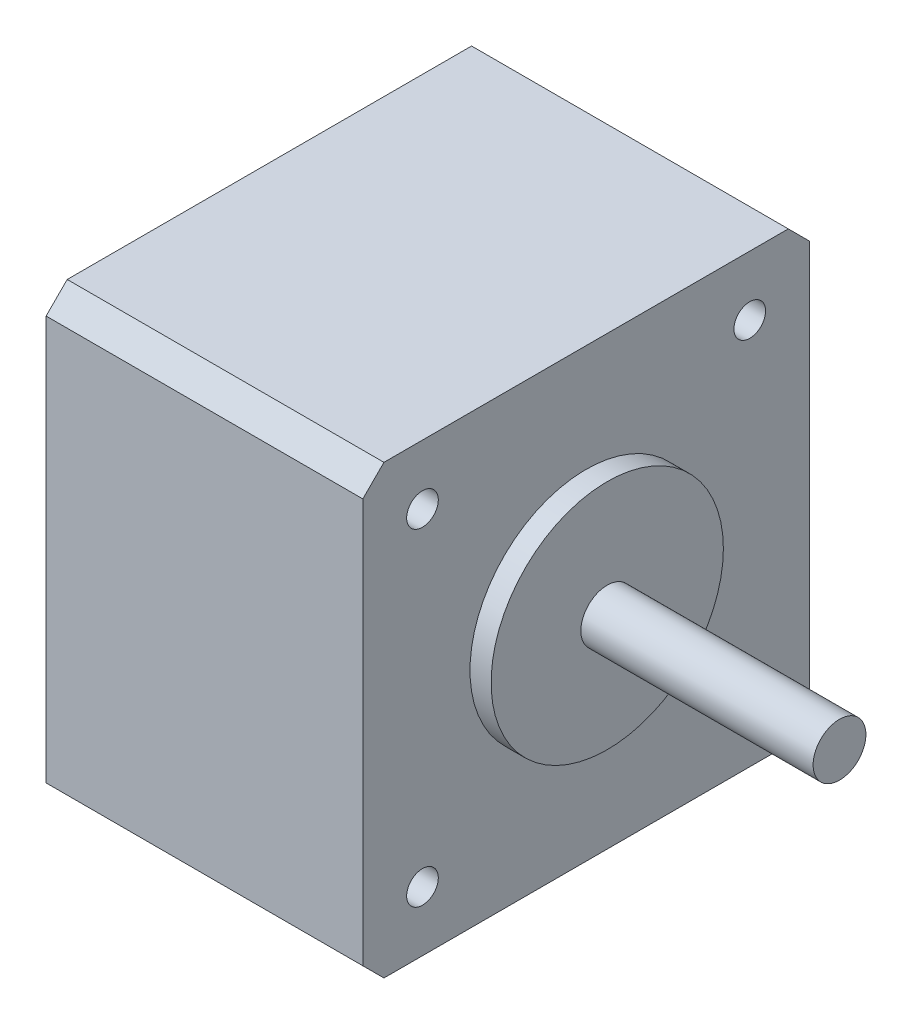
ISO-10303-21;
HEADER;
FILE_DESCRIPTION(('STEP AP214'),'2;1');
FILE_NAME('part.step','',(''),(''),'','','');
FILE_SCHEMA(('AUTOMOTIVE_DESIGN { 1 0 10303 214 1 1 1 1 }'));
ENDSEC;
DATA;
#1=APPLICATION_CONTEXT('core data for automotive mechanical design processes');
#2=APPLICATION_PROTOCOL_DEFINITION('international standard','automotive_design',2000,#1);
#3=PRODUCT_CONTEXT('',#1,'mechanical');
#4=PRODUCT('Part','Part','',(#3));
#5=PRODUCT_RELATED_PRODUCT_CATEGORY('part','',(#4));
#6=PRODUCT_DEFINITION_FORMATION('','',#4);
#7=PRODUCT_DEFINITION_CONTEXT('part definition',#1,'design');
#8=PRODUCT_DEFINITION('design','',#6,#7);
#9=PRODUCT_DEFINITION_SHAPE('','',#8);
#10=(LENGTH_UNIT() NAMED_UNIT(*) SI_UNIT(.MILLI.,.METRE.));
#11=(NAMED_UNIT(*) PLANE_ANGLE_UNIT() SI_UNIT($,.RADIAN.));
#12=(NAMED_UNIT(*) SI_UNIT($,.STERADIAN.) SOLID_ANGLE_UNIT());
#13=UNCERTAINTY_MEASURE_WITH_UNIT(LENGTH_MEASURE(1.E-05),#10,'distance_accuracy_value','');
#14=(GEOMETRIC_REPRESENTATION_CONTEXT(3) GLOBAL_UNCERTAINTY_ASSIGNED_CONTEXT((#13)) GLOBAL_UNIT_ASSIGNED_CONTEXT((#10,
#11,#12)) REPRESENTATION_CONTEXT('',''));
#15=CARTESIAN_POINT('',(0.,0.,0.));
#16=DIRECTION('',(0.,0.,1.));
#17=DIRECTION('',(1.,0.,0.));
#18=AXIS2_PLACEMENT_3D('',#15,#16,#17);
#19=CARTESIAN_POINT('',(30.,-21.15,21.15));
#20=DIRECTION('',(0.,0.,-1.));
#21=DIRECTION('',(-1.,0.,0.));
#22=AXIS2_PLACEMENT_3D('',#19,#20,#21);
#23=PLANE('',#22);
#24=DIRECTION('',(0.,-1.,0.));
#25=VECTOR('',#24,1.);
#26=CARTESIAN_POINT('',(0.,-21.15,21.15));
#27=LINE('',#26,#25);
#28=CARTESIAN_POINT('',(0.,19.15,21.15));
#29=VERTEX_POINT('',#28);
#30=CARTESIAN_POINT('',(0.,-19.15,21.15));
#31=VERTEX_POINT('',#30);
#32=EDGE_CURVE('E128',#29,#31,#27,.T.);
#33=ORIENTED_EDGE('',*,*,#32,.T.);
#34=DIRECTION('',(1.,0.,0.));
#35=VECTOR('',#34,1.);
#36=CARTESIAN_POINT('',(30.,-19.15,21.15));
#37=LINE('',#36,#35);
#38=CARTESIAN_POINT('',(30.,-19.15,21.15));
#39=VERTEX_POINT('',#38);
#40=EDGE_CURVE('E106',#31,#39,#37,.T.);
#41=ORIENTED_EDGE('',*,*,#40,.T.);
#42=DIRECTION('',(0.,-1.,0.));
#43=VECTOR('',#42,1.);
#44=CARTESIAN_POINT('',(30.,-21.15,21.15));
#45=LINE('',#44,#43);
#46=CARTESIAN_POINT('',(30.,19.15,21.15));
#47=VERTEX_POINT('',#46);
#48=EDGE_CURVE('E138',#47,#39,#45,.T.);
#49=ORIENTED_EDGE('',*,*,#48,.F.);
#50=DIRECTION('',(-1.,0.,0.));
#51=VECTOR('',#50,1.);
#52=CARTESIAN_POINT('',(30.,19.15,21.15));
#53=LINE('',#52,#51);
#54=EDGE_CURVE('E111',#47,#29,#53,.T.);
#55=ORIENTED_EDGE('',*,*,#54,.T.);
#56=EDGE_LOOP('',(#33,#41,#49,#55));
#57=FACE_BOUND('',#56,.T.);
#58=ADVANCED_FACE('F35',(#57),#23,.F.);
#59=CARTESIAN_POINT('',(30.,-21.15,-21.15));
#60=DIRECTION('',(0.,1.,0.));
#61=DIRECTION('',(0.,0.,1.));
#62=AXIS2_PLACEMENT_3D('',#59,#60,#61);
#63=PLANE('',#62);
#64=DIRECTION('',(0.,0.,-1.));
#65=VECTOR('',#64,1.);
#66=CARTESIAN_POINT('',(30.,-21.15,-21.15));
#67=LINE('',#66,#65);
#68=CARTESIAN_POINT('',(30.,-21.15,19.15));
#69=VERTEX_POINT('',#68);
#70=CARTESIAN_POINT('',(30.,-21.15,-19.15));
#71=VERTEX_POINT('',#70);
#72=EDGE_CURVE('E121',#69,#71,#67,.T.);
#73=ORIENTED_EDGE('',*,*,#72,.F.);
#74=DIRECTION('',(-1.,0.,0.));
#75=VECTOR('',#74,1.);
#76=CARTESIAN_POINT('',(30.,-21.15,19.15));
#77=LINE('',#76,#75);
#78=CARTESIAN_POINT('',(0.,-21.15,19.15));
#79=VERTEX_POINT('',#78);
#80=EDGE_CURVE('E105',#69,#79,#77,.T.);
#81=ORIENTED_EDGE('',*,*,#80,.T.);
#82=DIRECTION('',(0.,0.,-1.));
#83=VECTOR('',#82,1.);
#84=CARTESIAN_POINT('',(0.,-21.15,-21.15));
#85=LINE('',#84,#83);
#86=CARTESIAN_POINT('',(0.,-21.15,-19.15));
#87=VERTEX_POINT('',#86);
#88=EDGE_CURVE('E118',#79,#87,#85,.T.);
#89=ORIENTED_EDGE('',*,*,#88,.T.);
#90=DIRECTION('',(1.,0.,0.));
#91=VECTOR('',#90,1.);
#92=CARTESIAN_POINT('',(30.,-21.15,-19.15));
#93=LINE('',#92,#91);
#94=EDGE_CURVE('E123',#87,#71,#93,.T.);
#95=ORIENTED_EDGE('',*,*,#94,.T.);
#96=EDGE_LOOP('',(#73,#81,#89,#95));
#97=FACE_BOUND('',#96,.T.);
#98=ADVANCED_FACE('F117',(#97),#63,.F.);
#99=CARTESIAN_POINT('',(30.,-21.15,-21.15));
#100=DIRECTION('',(0.,0.,1.));
#101=DIRECTION('',(1.,0.,0.));
#102=AXIS2_PLACEMENT_3D('',#99,#100,#101);
#103=PLANE('',#102);
#104=DIRECTION('',(0.,1.,0.));
#105=VECTOR('',#104,1.);
#106=CARTESIAN_POINT('',(30.,-21.15,-21.15));
#107=LINE('',#106,#105);
#108=CARTESIAN_POINT('',(30.,-19.15,-21.15));
#109=VERTEX_POINT('',#108);
#110=CARTESIAN_POINT('',(30.,19.15,-21.15));
#111=VERTEX_POINT('',#110);
#112=EDGE_CURVE('E164',#109,#111,#107,.T.);
#113=ORIENTED_EDGE('',*,*,#112,.F.);
#114=DIRECTION('',(-1.,0.,0.));
#115=VECTOR('',#114,1.);
#116=CARTESIAN_POINT('',(30.,-19.15,-21.15));
#117=LINE('',#116,#115);
#118=CARTESIAN_POINT('',(0.,-19.15,-21.15));
#119=VERTEX_POINT('',#118);
#120=EDGE_CURVE('E157',#109,#119,#117,.T.);
#121=ORIENTED_EDGE('',*,*,#120,.T.);
#122=DIRECTION('',(0.,1.,0.));
#123=VECTOR('',#122,1.);
#124=CARTESIAN_POINT('',(0.,-21.15,-21.15));
#125=LINE('',#124,#123);
#126=CARTESIAN_POINT('',(0.,19.15,-21.15));
#127=VERTEX_POINT('',#126);
#128=EDGE_CURVE('E127',#119,#127,#125,.T.);
#129=ORIENTED_EDGE('',*,*,#128,.T.);
#130=DIRECTION('',(1.,0.,0.));
#131=VECTOR('',#130,1.);
#132=CARTESIAN_POINT('',(30.,19.15,-21.15));
#133=LINE('',#132,#131);
#134=EDGE_CURVE('E155',#127,#111,#133,.T.);
#135=ORIENTED_EDGE('',*,*,#134,.T.);
#136=EDGE_LOOP('',(#113,#121,#129,#135));
#137=FACE_BOUND('',#136,.T.);
#138=ADVANCED_FACE('F162',(#137),#103,.F.);
#139=CARTESIAN_POINT('',(30.,21.15,-21.15));
#140=DIRECTION('',(0.,-1.,0.));
#141=DIRECTION('',(0.,0.,-1.));
#142=AXIS2_PLACEMENT_3D('',#139,#140,#141);
#143=PLANE('',#142);
#144=DIRECTION('',(0.,0.,1.));
#145=VECTOR('',#144,1.);
#146=CARTESIAN_POINT('',(30.,21.15,-21.15));
#147=LINE('',#146,#145);
#148=CARTESIAN_POINT('',(30.,21.15,-19.15));
#149=VERTEX_POINT('',#148);
#150=CARTESIAN_POINT('',(30.,21.15,19.15));
#151=VERTEX_POINT('',#150);
#152=EDGE_CURVE('E139',#149,#151,#147,.T.);
#153=ORIENTED_EDGE('',*,*,#152,.F.);
#154=DIRECTION('',(-1.,0.,0.));
#155=VECTOR('',#154,1.);
#156=CARTESIAN_POINT('',(30.,21.15,-19.15));
#157=LINE('',#156,#155);
#158=CARTESIAN_POINT('',(0.,21.15,-19.15));
#159=VERTEX_POINT('',#158);
#160=EDGE_CURVE('E11',#149,#159,#157,.T.);
#161=ORIENTED_EDGE('',*,*,#160,.T.);
#162=DIRECTION('',(0.,0.,1.));
#163=VECTOR('',#162,1.);
#164=CARTESIAN_POINT('',(0.,21.15,-21.15));
#165=LINE('',#164,#163);
#166=CARTESIAN_POINT('',(0.,21.15,19.15));
#167=VERTEX_POINT('',#166);
#168=EDGE_CURVE('E131',#159,#167,#165,.T.);
#169=ORIENTED_EDGE('',*,*,#168,.T.);
#170=DIRECTION('',(1.,0.,0.));
#171=VECTOR('',#170,1.);
#172=CARTESIAN_POINT('',(30.,21.15,19.15));
#173=LINE('',#172,#171);
#174=EDGE_CURVE('E43',#167,#151,#173,.T.);
#175=ORIENTED_EDGE('',*,*,#174,.T.);
#176=EDGE_LOOP('',(#153,#161,#169,#175));
#177=FACE_BOUND('',#176,.T.);
#178=ADVANCED_FACE('F171',(#177),#143,.F.);
#179=CARTESIAN_POINT('',(30.,0.,0.));
#180=DIRECTION('',(1.,0.,0.));
#181=DIRECTION('',(0.,0.,-1.));
#182=AXIS2_PLACEMENT_3D('',#179,#180,#181);
#183=PLANE('',#182);
#184=CARTESIAN_POINT('',(30.,0.,0.));
#185=DIRECTION('',(1.,0.,0.));
#186=DIRECTION('',(0.,0.,-1.));
#187=AXIS2_PLACEMENT_3D('',#184,#185,#186);
#188=CIRCLE('',#187,11.);
#189=CARTESIAN_POINT('',(30.,0.,-11.));
#190=VERTEX_POINT('',#189);
#191=EDGE_CURVE('E202',#190,#190,#188,.T.);
#192=ORIENTED_EDGE('',*,*,#191,.F.);
#193=EDGE_LOOP('',(#192));
#194=FACE_BOUND('',#193,.T.);
#195=CARTESIAN_POINT('',(30.,15.5000000000009,-15.5));
#196=DIRECTION('',(1.,0.,0.));
#197=DIRECTION('',(0.,0.,-1.));
#198=AXIS2_PLACEMENT_3D('',#195,#196,#197);
#199=CIRCLE('',#198,1.5000000000009);
#200=CARTESIAN_POINT('',(30.,15.5000000000009,-17.0000000000009));
#201=VERTEX_POINT('',#200);
#202=EDGE_CURVE('E197',#201,#201,#199,.T.);
#203=ORIENTED_EDGE('',*,*,#202,.F.);
#204=EDGE_LOOP('',(#203));
#205=FACE_BOUND('',#204,.T.);
#206=CARTESIAN_POINT('',(30.,-15.4999999999991,-15.5000000000009));
#207=DIRECTION('',(1.,0.,0.));
#208=DIRECTION('',(0.,0.,-1.));
#209=AXIS2_PLACEMENT_3D('',#206,#207,#208);
#210=CIRCLE('',#209,1.50000000000122);
#211=CARTESIAN_POINT('',(30.,-15.4999999999991,-17.0000000000021));
#212=VERTEX_POINT('',#211);
#213=EDGE_CURVE('E191',#212,#212,#210,.T.);
#214=ORIENTED_EDGE('',*,*,#213,.F.);
#215=EDGE_LOOP('',(#214));
#216=FACE_BOUND('',#215,.T.);
#217=CARTESIAN_POINT('',(30.,-15.5,15.4999999999991));
#218=DIRECTION('',(1.,0.,0.));
#219=DIRECTION('',(0.,0.,-1.));
#220=AXIS2_PLACEMENT_3D('',#217,#218,#219);
#221=CIRCLE('',#220,1.50000000000046);
#222=CARTESIAN_POINT('',(30.,-15.5,13.9999999999987));
#223=VERTEX_POINT('',#222);
#224=EDGE_CURVE('E184',#223,#223,#221,.T.);
#225=ORIENTED_EDGE('',*,*,#224,.F.);
#226=EDGE_LOOP('',(#225));
#227=FACE_BOUND('',#226,.T.);
#228=CARTESIAN_POINT('',(30.,15.5,15.5));
#229=DIRECTION('',(1.,0.,0.));
#230=DIRECTION('',(0.,0.,-1.));
#231=AXIS2_PLACEMENT_3D('',#228,#229,#230);
#232=CIRCLE('',#231,1.5);
#233=CARTESIAN_POINT('',(30.,15.5,14.));
#234=VERTEX_POINT('',#233);
#235=EDGE_CURVE('E178',#234,#234,#232,.T.);
#236=ORIENTED_EDGE('',*,*,#235,.F.);
#237=EDGE_LOOP('',(#236));
#238=FACE_BOUND('',#237,.T.);
#239=ORIENTED_EDGE('',*,*,#48,.T.);
#240=DIRECTION('',(0.,0.707106781186549,0.707106781186546));
#241=VECTOR('',#240,1.);
#242=CARTESIAN_POINT('',(30.,-20.15,20.15));
#243=LINE('',#242,#241);
#244=EDGE_CURVE('E153',#39,#69,#243,.F.);
#245=ORIENTED_EDGE('',*,*,#244,.T.);
#246=ORIENTED_EDGE('',*,*,#72,.T.);
#247=DIRECTION('',(0.,-0.707106781186546,0.707106781186549));
#248=VECTOR('',#247,1.);
#249=CARTESIAN_POINT('',(30.,-20.15,-20.1499999999999));
#250=LINE('',#249,#248);
#251=EDGE_CURVE('E151',#71,#109,#250,.F.);
#252=ORIENTED_EDGE('',*,*,#251,.T.);
#253=ORIENTED_EDGE('',*,*,#112,.T.);
#254=DIRECTION('',(0.,-0.707106781186548,-0.707106781186547));
#255=VECTOR('',#254,1.);
#256=CARTESIAN_POINT('',(30.,20.15,-20.15));
#257=LINE('',#256,#255);
#258=EDGE_CURVE('E56',#111,#149,#257,.F.);
#259=ORIENTED_EDGE('',*,*,#258,.T.);
#260=ORIENTED_EDGE('',*,*,#152,.T.);
#261=DIRECTION('',(0.,0.707106781186548,-0.707106781186547));
#262=VECTOR('',#261,1.);
#263=CARTESIAN_POINT('',(30.,20.15,20.15));
#264=LINE('',#263,#262);
#265=EDGE_CURVE('E148',#151,#47,#264,.F.);
#266=ORIENTED_EDGE('',*,*,#265,.T.);
#267=EDGE_LOOP('',(#239,#245,#246,#252,#253,#259,#260,#266));
#268=FACE_BOUND('',#267,.T.);
#269=ADVANCED_FACE('F235',(#194,#205,#216,#227,#238,#268),#183,.T.);
#270=CARTESIAN_POINT('',(0.,0.,0.));
#271=DIRECTION('',(1.,0.,0.));
#272=DIRECTION('',(0.,0.,-1.));
#273=AXIS2_PLACEMENT_3D('',#270,#271,#272);
#274=PLANE('',#273);
#275=ORIENTED_EDGE('',*,*,#88,.F.);
#276=DIRECTION('',(0.,-0.707106781186549,-0.707106781186546));
#277=VECTOR('',#276,1.);
#278=CARTESIAN_POINT('',(0.,-21.15,19.15));
#279=LINE('',#278,#277);
#280=EDGE_CURVE('E101',#79,#31,#279,.F.);
#281=ORIENTED_EDGE('',*,*,#280,.T.);
#282=ORIENTED_EDGE('',*,*,#32,.F.);
#283=DIRECTION('',(0.,-0.707106781186548,0.707106781186547));
#284=VECTOR('',#283,1.);
#285=CARTESIAN_POINT('',(0.,19.15,21.15));
#286=LINE('',#285,#284);
#287=EDGE_CURVE('E122',#29,#167,#286,.F.);
#288=ORIENTED_EDGE('',*,*,#287,.T.);
#289=ORIENTED_EDGE('',*,*,#168,.F.);
#290=DIRECTION('',(0.,0.707106781186548,0.707106781186547));
#291=VECTOR('',#290,1.);
#292=CARTESIAN_POINT('',(0.,21.15,-19.15));
#293=LINE('',#292,#291);
#294=EDGE_CURVE('E142',#159,#127,#293,.F.);
#295=ORIENTED_EDGE('',*,*,#294,.T.);
#296=ORIENTED_EDGE('',*,*,#128,.F.);
#297=DIRECTION('',(0.,0.707106781186546,-0.707106781186549));
#298=VECTOR('',#297,1.);
#299=CARTESIAN_POINT('',(0.,-19.15,-21.15));
#300=LINE('',#299,#298);
#301=EDGE_CURVE('E112',#119,#87,#300,.F.);
#302=ORIENTED_EDGE('',*,*,#301,.T.);
#303=EDGE_LOOP('',(#275,#281,#282,#288,#289,#295,#296,#302));
#304=FACE_BOUND('',#303,.T.);
#305=ADVANCED_FACE('F125',(#304),#274,.F.);
#306=CARTESIAN_POINT('',(30.,-21.15,19.15));
#307=DIRECTION('',(0.,0.707106781186546,-0.707106781186549));
#308=DIRECTION('',(-1.,0.,0.));
#309=AXIS2_PLACEMENT_3D('',#306,#307,#308);
#310=PLANE('',#309);
#311=ORIENTED_EDGE('',*,*,#244,.F.);
#312=ORIENTED_EDGE('',*,*,#40,.F.);
#313=ORIENTED_EDGE('',*,*,#280,.F.);
#314=ORIENTED_EDGE('',*,*,#80,.F.);
#315=EDGE_LOOP('',(#311,#312,#313,#314));
#316=FACE_BOUND('',#315,.T.);
#317=ADVANCED_FACE('F104',(#316),#310,.F.);
#318=CARTESIAN_POINT('',(30.,-19.15,-21.15));
#319=DIRECTION('',(0.,0.707106781186549,0.707106781186546));
#320=DIRECTION('',(-1.,0.,0.));
#321=AXIS2_PLACEMENT_3D('',#318,#319,#320);
#322=PLANE('',#321);
#323=ORIENTED_EDGE('',*,*,#251,.F.);
#324=ORIENTED_EDGE('',*,*,#94,.F.);
#325=ORIENTED_EDGE('',*,*,#301,.F.);
#326=ORIENTED_EDGE('',*,*,#120,.F.);
#327=EDGE_LOOP('',(#323,#324,#325,#326));
#328=FACE_BOUND('',#327,.T.);
#329=ADVANCED_FACE('F259',(#328),#322,.F.);
#330=CARTESIAN_POINT('',(30.,21.15,-19.15));
#331=DIRECTION('',(0.,-0.707106781186547,0.707106781186548));
#332=DIRECTION('',(-1.,0.,0.));
#333=AXIS2_PLACEMENT_3D('',#330,#331,#332);
#334=PLANE('',#333);
#335=ORIENTED_EDGE('',*,*,#258,.F.);
#336=ORIENTED_EDGE('',*,*,#134,.F.);
#337=ORIENTED_EDGE('',*,*,#294,.F.);
#338=ORIENTED_EDGE('',*,*,#160,.F.);
#339=EDGE_LOOP('',(#335,#336,#337,#338));
#340=FACE_BOUND('',#339,.T.);
#341=ADVANCED_FACE('F170',(#340),#334,.F.);
#342=CARTESIAN_POINT('',(30.,19.15,21.15));
#343=DIRECTION('',(0.,-0.707106781186547,-0.707106781186548));
#344=DIRECTION('',(-1.,0.,0.));
#345=AXIS2_PLACEMENT_3D('',#342,#343,#344);
#346=PLANE('',#345);
#347=ORIENTED_EDGE('',*,*,#265,.F.);
#348=ORIENTED_EDGE('',*,*,#174,.F.);
#349=ORIENTED_EDGE('',*,*,#287,.F.);
#350=ORIENTED_EDGE('',*,*,#54,.F.);
#351=EDGE_LOOP('',(#347,#348,#349,#350));
#352=FACE_BOUND('',#351,.T.);
#353=ADVANCED_FACE('F37',(#352),#346,.F.);
#354=CARTESIAN_POINT('',(27.,15.5,15.5));
#355=DIRECTION('',(1.,0.,0.));
#356=DIRECTION('',(0.,0.,-1.));
#357=AXIS2_PLACEMENT_3D('',#354,#355,#356);
#358=CYLINDRICAL_SURFACE('',#357,1.5);
#359=CARTESIAN_POINT('',(27.,15.5,15.5));
#360=DIRECTION('',(1.,0.,0.));
#361=DIRECTION('',(0.,0.,-1.));
#362=AXIS2_PLACEMENT_3D('',#359,#360,#361);
#363=CIRCLE('',#362,1.5);
#364=CARTESIAN_POINT('',(27.,15.5,14.));
#365=VERTEX_POINT('',#364);
#366=EDGE_CURVE('E133',#365,#365,#363,.T.);
#367=ORIENTED_EDGE('',*,*,#366,.F.);
#368=EDGE_LOOP('',(#367));
#369=FACE_BOUND('',#368,.T.);
#370=ORIENTED_EDGE('',*,*,#235,.T.);
#371=EDGE_LOOP('',(#370));
#372=FACE_BOUND('',#371,.T.);
#373=ADVANCED_FACE('F251',(#369,#372),#358,.F.);
#374=CARTESIAN_POINT('',(27.,15.5,15.5));
#375=DIRECTION('',(1.,0.,0.));
#376=DIRECTION('',(0.,0.,-1.));
#377=AXIS2_PLACEMENT_3D('',#374,#375,#376);
#378=PLANE('',#377);
#379=ORIENTED_EDGE('',*,*,#366,.T.);
#380=EDGE_LOOP('',(#379));
#381=FACE_BOUND('',#380,.T.);
#382=ADVANCED_FACE('F256',(#381),#378,.T.);
#383=CARTESIAN_POINT('',(27.,-15.5,15.4999999999991));
#384=DIRECTION('',(1.,0.,0.));
#385=DIRECTION('',(0.,0.,-1.));
#386=AXIS2_PLACEMENT_3D('',#383,#384,#385);
#387=CYLINDRICAL_SURFACE('',#386,1.50000000000046);
#388=CARTESIAN_POINT('',(27.,-15.5,15.4999999999991));
#389=DIRECTION('',(1.,0.,0.));
#390=DIRECTION('',(0.,0.,-1.));
#391=AXIS2_PLACEMENT_3D('',#388,#389,#390);
#392=CIRCLE('',#391,1.50000000000046);
#393=CARTESIAN_POINT('',(27.,-15.5,13.9999999999987));
#394=VERTEX_POINT('',#393);
#395=EDGE_CURVE('E187',#394,#394,#392,.T.);
#396=ORIENTED_EDGE('',*,*,#395,.F.);
#397=EDGE_LOOP('',(#396));
#398=FACE_BOUND('',#397,.T.);
#399=ORIENTED_EDGE('',*,*,#224,.T.);
#400=EDGE_LOOP('',(#399));
#401=FACE_BOUND('',#400,.T.);
#402=ADVANCED_FACE('F299',(#398,#401),#387,.F.);
#403=CARTESIAN_POINT('',(27.,-15.5,15.4999999999991));
#404=DIRECTION('',(1.,0.,0.));
#405=DIRECTION('',(0.,0.,-1.));
#406=AXIS2_PLACEMENT_3D('',#403,#404,#405);
#407=PLANE('',#406);
#408=ORIENTED_EDGE('',*,*,#395,.T.);
#409=EDGE_LOOP('',(#408));
#410=FACE_BOUND('',#409,.T.);
#411=ADVANCED_FACE('F309',(#410),#407,.T.);
#412=CARTESIAN_POINT('',(27.,-15.4999999999991,-15.5000000000009));
#413=DIRECTION('',(1.,0.,0.));
#414=DIRECTION('',(0.,0.,-1.));
#415=AXIS2_PLACEMENT_3D('',#412,#413,#414);
#416=CYLINDRICAL_SURFACE('',#415,1.50000000000122);
#417=CARTESIAN_POINT('',(27.,-15.4999999999991,-15.5000000000009));
#418=DIRECTION('',(1.,0.,0.));
#419=DIRECTION('',(0.,0.,-1.));
#420=AXIS2_PLACEMENT_3D('',#417,#418,#419);
#421=CIRCLE('',#420,1.50000000000122);
#422=CARTESIAN_POINT('',(27.,-15.4999999999991,-17.0000000000021));
#423=VERTEX_POINT('',#422);
#424=EDGE_CURVE('E194',#423,#423,#421,.T.);
#425=ORIENTED_EDGE('',*,*,#424,.F.);
#426=EDGE_LOOP('',(#425));
#427=FACE_BOUND('',#426,.T.);
#428=ORIENTED_EDGE('',*,*,#213,.T.);
#429=EDGE_LOOP('',(#428));
#430=FACE_BOUND('',#429,.T.);
#431=ADVANCED_FACE('F319',(#427,#430),#416,.F.);
#432=CARTESIAN_POINT('',(27.,-15.4999999999991,-15.5000000000009));
#433=DIRECTION('',(1.,0.,0.));
#434=DIRECTION('',(0.,0.,-1.));
#435=AXIS2_PLACEMENT_3D('',#432,#433,#434);
#436=PLANE('',#435);
#437=ORIENTED_EDGE('',*,*,#424,.T.);
#438=EDGE_LOOP('',(#437));
#439=FACE_BOUND('',#438,.T.);
#440=ADVANCED_FACE('F329',(#439),#436,.T.);
#441=CARTESIAN_POINT('',(27.,15.5000000000009,-15.5));
#442=DIRECTION('',(1.,0.,0.));
#443=DIRECTION('',(0.,0.,-1.));
#444=AXIS2_PLACEMENT_3D('',#441,#442,#443);
#445=CYLINDRICAL_SURFACE('',#444,1.5000000000009);
#446=CARTESIAN_POINT('',(27.,15.5000000000009,-15.5));
#447=DIRECTION('',(1.,0.,0.));
#448=DIRECTION('',(0.,0.,-1.));
#449=AXIS2_PLACEMENT_3D('',#446,#447,#448);
#450=CIRCLE('',#449,1.5000000000009);
#451=CARTESIAN_POINT('',(27.,15.5000000000009,-17.0000000000009));
#452=VERTEX_POINT('',#451);
#453=EDGE_CURVE('E181',#452,#452,#450,.T.);
#454=ORIENTED_EDGE('',*,*,#453,.F.);
#455=EDGE_LOOP('',(#454));
#456=FACE_BOUND('',#455,.T.);
#457=ORIENTED_EDGE('',*,*,#202,.T.);
#458=EDGE_LOOP('',(#457));
#459=FACE_BOUND('',#458,.T.);
#460=ADVANCED_FACE('F339',(#456,#459),#445,.F.);
#461=CARTESIAN_POINT('',(27.,15.5000000000009,-15.5));
#462=DIRECTION('',(1.,0.,0.));
#463=DIRECTION('',(0.,0.,-1.));
#464=AXIS2_PLACEMENT_3D('',#461,#462,#463);
#465=PLANE('',#464);
#466=ORIENTED_EDGE('',*,*,#453,.T.);
#467=EDGE_LOOP('',(#466));
#468=FACE_BOUND('',#467,.T.);
#469=ADVANCED_FACE('F231',(#468),#465,.T.);
#470=CARTESIAN_POINT('',(32.,0.,0.));
#471=DIRECTION('',(-1.,0.,0.));
#472=DIRECTION('',(0.,0.,1.));
#473=AXIS2_PLACEMENT_3D('',#470,#471,#472);
#474=CYLINDRICAL_SURFACE('',#473,11.);
#475=CARTESIAN_POINT('',(32.,0.,0.));
#476=DIRECTION('',(1.,0.,0.));
#477=DIRECTION('',(0.,0.,-1.));
#478=AXIS2_PLACEMENT_3D('',#475,#476,#477);
#479=CIRCLE('',#478,11.);
#480=CARTESIAN_POINT('',(32.,0.,-11.));
#481=VERTEX_POINT('',#480);
#482=EDGE_CURVE('E188',#481,#481,#479,.T.);
#483=ORIENTED_EDGE('',*,*,#482,.F.);
#484=EDGE_LOOP('',(#483));
#485=FACE_BOUND('',#484,.T.);
#486=ORIENTED_EDGE('',*,*,#191,.T.);
#487=EDGE_LOOP('',(#486));
#488=FACE_BOUND('',#487,.T.);
#489=ADVANCED_FACE('F225',(#485,#488),#474,.T.);
#490=CARTESIAN_POINT('',(32.,0.,0.));
#491=DIRECTION('',(1.,0.,0.));
#492=DIRECTION('',(0.,0.,-1.));
#493=AXIS2_PLACEMENT_3D('',#490,#491,#492);
#494=PLANE('',#493);
#495=CARTESIAN_POINT('',(32.,0.,0.));
#496=DIRECTION('',(1.,0.,0.));
#497=DIRECTION('',(0.,0.,-1.));
#498=AXIS2_PLACEMENT_3D('',#495,#496,#497);
#499=CIRCLE('',#498,2.5);
#500=CARTESIAN_POINT('',(32.,0.,-2.5));
#501=VERTEX_POINT('',#500);
#502=EDGE_CURVE('E208',#501,#501,#499,.T.);
#503=ORIENTED_EDGE('',*,*,#502,.F.);
#504=EDGE_LOOP('',(#503));
#505=FACE_BOUND('',#504,.T.);
#506=ORIENTED_EDGE('',*,*,#482,.T.);
#507=EDGE_LOOP('',(#506));
#508=FACE_BOUND('',#507,.T.);
#509=ADVANCED_FACE('F219',(#505,#508),#494,.T.);
#510=CARTESIAN_POINT('',(54.,0.,0.));
#511=DIRECTION('',(-1.,0.,0.));
#512=DIRECTION('',(0.,0.,1.));
#513=AXIS2_PLACEMENT_3D('',#510,#511,#512);
#514=CYLINDRICAL_SURFACE('',#513,2.5);
#515=CARTESIAN_POINT('',(54.,0.,0.));
#516=DIRECTION('',(1.,0.,0.));
#517=DIRECTION('',(0.,0.,-1.));
#518=AXIS2_PLACEMENT_3D('',#515,#516,#517);
#519=CIRCLE('',#518,2.5);
#520=CARTESIAN_POINT('',(54.,0.,-2.5));
#521=VERTEX_POINT('',#520);
#522=EDGE_CURVE('E205',#521,#521,#519,.T.);
#523=ORIENTED_EDGE('',*,*,#522,.F.);
#524=EDGE_LOOP('',(#523));
#525=FACE_BOUND('',#524,.T.);
#526=ORIENTED_EDGE('',*,*,#502,.T.);
#527=EDGE_LOOP('',(#526));
#528=FACE_BOUND('',#527,.T.);
#529=ADVANCED_FACE('F216',(#525,#528),#514,.T.);
#530=CARTESIAN_POINT('',(54.,0.,0.));
#531=DIRECTION('',(1.,0.,0.));
#532=DIRECTION('',(0.,0.,-1.));
#533=AXIS2_PLACEMENT_3D('',#530,#531,#532);
#534=PLANE('',#533);
#535=ORIENTED_EDGE('',*,*,#522,.T.);
#536=EDGE_LOOP('',(#535));
#537=FACE_BOUND('',#536,.T.);
#538=ADVANCED_FACE('F214',(#537),#534,.T.);
#539=CLOSED_SHELL('',(#58,#98,#138,#178,#269,#305,#317,#329,#341,#353,#373,#382,#402,#411,#431,
#440,#460,#469,#489,#509,#529,#538));
#540=MANIFOLD_SOLID_BREP('B2',#539);
#541=ADVANCED_BREP_SHAPE_REPRESENTATION('',(#18,#540),#14);
#542=SHAPE_DEFINITION_REPRESENTATION(#9,#541);
ENDSEC;
END-ISO-10303-21;
